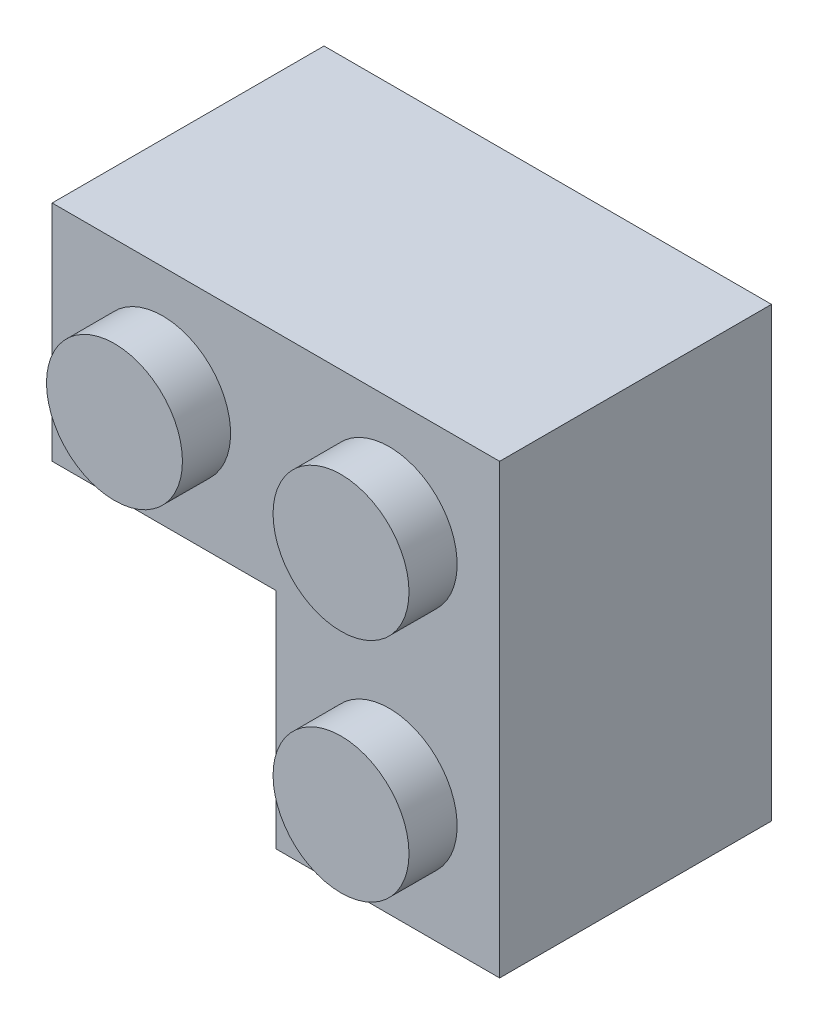
ISO-10303-21;
HEADER;
FILE_DESCRIPTION(('STEP AP214'),'2;1');
FILE_NAME('part.step','',(''),(''),'','','');
FILE_SCHEMA(('AUTOMOTIVE_DESIGN { 1 0 10303 214 1 1 1 1 }'));
ENDSEC;
DATA;
#1=APPLICATION_CONTEXT('core data for automotive mechanical design processes');
#2=APPLICATION_PROTOCOL_DEFINITION('international standard','automotive_design',2000,#1);
#3=PRODUCT_CONTEXT('',#1,'mechanical');
#4=PRODUCT('Part','Part','',(#3));
#5=PRODUCT_RELATED_PRODUCT_CATEGORY('part','',(#4));
#6=PRODUCT_DEFINITION_FORMATION('','',#4);
#7=PRODUCT_DEFINITION_CONTEXT('part definition',#1,'design');
#8=PRODUCT_DEFINITION('design','',#6,#7);
#9=PRODUCT_DEFINITION_SHAPE('','',#8);
#10=(LENGTH_UNIT() NAMED_UNIT(*) SI_UNIT(.MILLI.,.METRE.));
#11=(NAMED_UNIT(*) PLANE_ANGLE_UNIT() SI_UNIT($,.RADIAN.));
#12=(NAMED_UNIT(*) SI_UNIT($,.STERADIAN.) SOLID_ANGLE_UNIT());
#13=UNCERTAINTY_MEASURE_WITH_UNIT(LENGTH_MEASURE(1.E-05),#10,'distance_accuracy_value','');
#14=(GEOMETRIC_REPRESENTATION_CONTEXT(3) GLOBAL_UNCERTAINTY_ASSIGNED_CONTEXT((#13)) GLOBAL_UNIT_ASSIGNED_CONTEXT((#10,
#11,#12)) REPRESENTATION_CONTEXT('',''));
#15=CARTESIAN_POINT('',(0.,0.,0.));
#16=DIRECTION('',(0.,0.,1.));
#17=DIRECTION('',(1.,0.,0.));
#18=AXIS2_PLACEMENT_3D('',#15,#16,#17);
#19=CARTESIAN_POINT('',(7.9,7.90000000000001,9.6));
#20=DIRECTION('',(-1.,0.,0.));
#21=DIRECTION('',(0.,-1.,0.));
#22=AXIS2_PLACEMENT_3D('',#19,#20,#21);
#23=PLANE('',#22);
#24=DIRECTION('',(0.,1.,0.));
#25=VECTOR('',#24,1.);
#26=CARTESIAN_POINT('',(7.9,7.90000000000001,0.));
#27=LINE('',#26,#25);
#28=CARTESIAN_POINT('',(7.9,-7.9,0.));
#29=VERTEX_POINT('',#28);
#30=CARTESIAN_POINT('',(7.9,7.90000000000001,0.));
#31=VERTEX_POINT('',#30);
#32=EDGE_CURVE('E120',#29,#31,#27,.T.);
#33=ORIENTED_EDGE('',*,*,#32,.T.);
#34=DIRECTION('',(0.,0.,-1.));
#35=VECTOR('',#34,1.);
#36=CARTESIAN_POINT('',(7.9,7.90000000000001,9.6));
#37=LINE('',#36,#35);
#38=CARTESIAN_POINT('',(7.9,7.90000000000001,9.6));
#39=VERTEX_POINT('',#38);
#40=EDGE_CURVE('E138',#39,#31,#37,.T.);
#41=ORIENTED_EDGE('',*,*,#40,.F.);
#42=DIRECTION('',(0.,1.,0.));
#43=VECTOR('',#42,1.);
#44=CARTESIAN_POINT('',(7.9,7.90000000000001,9.6));
#45=LINE('',#44,#43);
#46=CARTESIAN_POINT('',(7.9,-7.9,9.6));
#47=VERTEX_POINT('',#46);
#48=EDGE_CURVE('E131',#47,#39,#45,.T.);
#49=ORIENTED_EDGE('',*,*,#48,.F.);
#50=DIRECTION('',(0.,0.,-1.));
#51=VECTOR('',#50,1.);
#52=CARTESIAN_POINT('',(7.9,-7.9,9.6));
#53=LINE('',#52,#51);
#54=EDGE_CURVE('E116',#47,#29,#53,.T.);
#55=ORIENTED_EDGE('',*,*,#54,.T.);
#56=EDGE_LOOP('',(#33,#41,#49,#55));
#57=FACE_BOUND('',#56,.T.);
#58=ADVANCED_FACE('F35',(#57),#23,.F.);
#59=CARTESIAN_POINT('',(7.9,7.90000000000001,9.6));
#60=DIRECTION('',(0.,-1.,0.));
#61=DIRECTION('',(1.,0.,0.));
#62=AXIS2_PLACEMENT_3D('',#59,#60,#61);
#63=PLANE('',#62);
#64=DIRECTION('',(-1.,0.,0.));
#65=VECTOR('',#64,1.);
#66=CARTESIAN_POINT('',(7.9,7.90000000000001,0.));
#67=LINE('',#66,#65);
#68=CARTESIAN_POINT('',(-7.9,7.9,0.));
#69=VERTEX_POINT('',#68);
#70=EDGE_CURVE('E123',#31,#69,#67,.T.);
#71=ORIENTED_EDGE('',*,*,#70,.T.);
#72=DIRECTION('',(0.,0.,-1.));
#73=VECTOR('',#72,1.);
#74=CARTESIAN_POINT('',(-7.9,7.9,9.6));
#75=LINE('',#74,#73);
#76=CARTESIAN_POINT('',(-7.9,7.9,9.6));
#77=VERTEX_POINT('',#76);
#78=EDGE_CURVE('E135',#77,#69,#75,.T.);
#79=ORIENTED_EDGE('',*,*,#78,.F.);
#80=DIRECTION('',(-1.,0.,0.));
#81=VECTOR('',#80,1.);
#82=CARTESIAN_POINT('',(7.9,7.90000000000001,9.6));
#83=LINE('',#82,#81);
#84=EDGE_CURVE('E89',#39,#77,#83,.T.);
#85=ORIENTED_EDGE('',*,*,#84,.F.);
#86=ORIENTED_EDGE('',*,*,#40,.T.);
#87=EDGE_LOOP('',(#71,#79,#85,#86));
#88=FACE_BOUND('',#87,.T.);
#89=ADVANCED_FACE('F170',(#88),#63,.F.);
#90=CARTESIAN_POINT('',(-7.9,7.9,9.6));
#91=DIRECTION('',(1.,0.,0.));
#92=DIRECTION('',(0.,1.,0.));
#93=AXIS2_PLACEMENT_3D('',#90,#91,#92);
#94=PLANE('',#93);
#95=DIRECTION('',(0.,-1.,0.));
#96=VECTOR('',#95,1.);
#97=CARTESIAN_POINT('',(-7.9,7.9,0.));
#98=LINE('',#97,#96);
#99=CARTESIAN_POINT('',(-7.9,0.,0.));
#100=VERTEX_POINT('',#99);
#101=EDGE_CURVE('E126',#69,#100,#98,.T.);
#102=ORIENTED_EDGE('',*,*,#101,.T.);
#103=DIRECTION('',(0.,0.,-1.));
#104=VECTOR('',#103,1.);
#105=CARTESIAN_POINT('',(-7.9,0.,9.6));
#106=LINE('',#105,#104);
#107=CARTESIAN_POINT('',(-7.9,0.,9.6));
#108=VERTEX_POINT('',#107);
#109=EDGE_CURVE('E111',#108,#100,#106,.T.);
#110=ORIENTED_EDGE('',*,*,#109,.F.);
#111=DIRECTION('',(0.,-1.,0.));
#112=VECTOR('',#111,1.);
#113=CARTESIAN_POINT('',(-7.9,7.9,9.6));
#114=LINE('',#113,#112);
#115=EDGE_CURVE('E102',#77,#108,#114,.T.);
#116=ORIENTED_EDGE('',*,*,#115,.F.);
#117=ORIENTED_EDGE('',*,*,#78,.T.);
#118=EDGE_LOOP('',(#102,#110,#116,#117));
#119=FACE_BOUND('',#118,.T.);
#120=ADVANCED_FACE('F175',(#119),#94,.F.);
#121=CARTESIAN_POINT('',(0.,0.,9.6));
#122=DIRECTION('',(0.,1.,0.));
#123=DIRECTION('',(0.,0.,1.));
#124=AXIS2_PLACEMENT_3D('',#121,#122,#123);
#125=PLANE('',#124);
#126=DIRECTION('',(1.,0.,0.));
#127=VECTOR('',#126,1.);
#128=CARTESIAN_POINT('',(0.,0.,0.));
#129=LINE('',#128,#127);
#130=CARTESIAN_POINT('',(0.,0.,0.));
#131=VERTEX_POINT('',#130);
#132=EDGE_CURVE('E110',#100,#131,#129,.T.);
#133=ORIENTED_EDGE('',*,*,#132,.T.);
#134=DIRECTION('',(0.,0.,-1.));
#135=VECTOR('',#134,1.);
#136=CARTESIAN_POINT('',(0.,0.,9.6));
#137=LINE('',#136,#135);
#138=CARTESIAN_POINT('',(0.,0.,9.6));
#139=VERTEX_POINT('',#138);
#140=EDGE_CURVE('E107',#139,#131,#137,.T.);
#141=ORIENTED_EDGE('',*,*,#140,.F.);
#142=DIRECTION('',(1.,0.,0.));
#143=VECTOR('',#142,1.);
#144=CARTESIAN_POINT('',(0.,0.,9.6));
#145=LINE('',#144,#143);
#146=EDGE_CURVE('E96',#108,#139,#145,.T.);
#147=ORIENTED_EDGE('',*,*,#146,.F.);
#148=ORIENTED_EDGE('',*,*,#109,.T.);
#149=EDGE_LOOP('',(#133,#141,#147,#148));
#150=FACE_BOUND('',#149,.T.);
#151=ADVANCED_FACE('F108',(#150),#125,.F.);
#152=CARTESIAN_POINT('',(0.,0.,9.6));
#153=DIRECTION('',(1.,0.,0.));
#154=DIRECTION('',(0.,0.,-1.));
#155=AXIS2_PLACEMENT_3D('',#152,#153,#154);
#156=PLANE('',#155);
#157=DIRECTION('',(0.,-1.,0.));
#158=VECTOR('',#157,1.);
#159=CARTESIAN_POINT('',(0.,0.,0.));
#160=LINE('',#159,#158);
#161=CARTESIAN_POINT('',(0.,-7.9,0.));
#162=VERTEX_POINT('',#161);
#163=EDGE_CURVE('E74',#131,#162,#160,.T.);
#164=ORIENTED_EDGE('',*,*,#163,.T.);
#165=DIRECTION('',(0.,0.,-1.));
#166=VECTOR('',#165,1.);
#167=CARTESIAN_POINT('',(0.,-7.9,9.6));
#168=LINE('',#167,#166);
#169=CARTESIAN_POINT('',(0.,-7.9,9.6));
#170=VERTEX_POINT('',#169);
#171=EDGE_CURVE('E112',#170,#162,#168,.T.);
#172=ORIENTED_EDGE('',*,*,#171,.F.);
#173=DIRECTION('',(0.,-1.,0.));
#174=VECTOR('',#173,1.);
#175=CARTESIAN_POINT('',(0.,0.,9.6));
#176=LINE('',#175,#174);
#177=EDGE_CURVE('E100',#139,#170,#176,.T.);
#178=ORIENTED_EDGE('',*,*,#177,.F.);
#179=ORIENTED_EDGE('',*,*,#140,.T.);
#180=EDGE_LOOP('',(#164,#172,#178,#179));
#181=FACE_BOUND('',#180,.T.);
#182=ADVANCED_FACE('F114',(#181),#156,.F.);
#183=CARTESIAN_POINT('',(7.9,-7.9,9.6));
#184=DIRECTION('',(0.,1.,0.));
#185=DIRECTION('',(-1.,0.,0.));
#186=AXIS2_PLACEMENT_3D('',#183,#184,#185);
#187=PLANE('',#186);
#188=DIRECTION('',(1.,0.,0.));
#189=VECTOR('',#188,1.);
#190=CARTESIAN_POINT('',(7.9,-7.9,0.));
#191=LINE('',#190,#189);
#192=EDGE_CURVE('E80',#162,#29,#191,.T.);
#193=ORIENTED_EDGE('',*,*,#192,.T.);
#194=ORIENTED_EDGE('',*,*,#54,.F.);
#195=DIRECTION('',(1.,0.,0.));
#196=VECTOR('',#195,1.);
#197=CARTESIAN_POINT('',(7.9,-7.9,9.6));
#198=LINE('',#197,#196);
#199=EDGE_CURVE('E51',#170,#47,#198,.T.);
#200=ORIENTED_EDGE('',*,*,#199,.F.);
#201=ORIENTED_EDGE('',*,*,#171,.T.);
#202=EDGE_LOOP('',(#193,#194,#200,#201));
#203=FACE_BOUND('',#202,.T.);
#204=ADVANCED_FACE('F150',(#203),#187,.F.);
#205=CARTESIAN_POINT('',(0.,0.,9.6));
#206=DIRECTION('',(0.,0.,-1.));
#207=DIRECTION('',(-1.,0.,0.));
#208=AXIS2_PLACEMENT_3D('',#205,#206,#207);
#209=PLANE('',#208);
#210=CARTESIAN_POINT('',(4.,-4.,9.6));
#211=DIRECTION('',(0.,0.,-1.));
#212=DIRECTION('',(-1.,0.,0.));
#213=AXIS2_PLACEMENT_3D('',#210,#211,#212);
#214=CIRCLE('',#213,2.4);
#215=CARTESIAN_POINT('',(1.60000000000001,-4.,9.6));
#216=VERTEX_POINT('',#215);
#217=EDGE_CURVE('E11',#216,#216,#214,.F.);
#218=ORIENTED_EDGE('',*,*,#217,.F.);
#219=EDGE_LOOP('',(#218));
#220=FACE_BOUND('',#219,.T.);
#221=CARTESIAN_POINT('',(4.,4.00000000000001,9.6));
#222=DIRECTION('',(0.,0.,-1.));
#223=DIRECTION('',(-1.,0.,0.));
#224=AXIS2_PLACEMENT_3D('',#221,#222,#223);
#225=CIRCLE('',#224,2.4);
#226=CARTESIAN_POINT('',(1.60000000000001,4.00000000000001,9.6));
#227=VERTEX_POINT('',#226);
#228=EDGE_CURVE('E43',#227,#227,#225,.F.);
#229=ORIENTED_EDGE('',*,*,#228,.F.);
#230=EDGE_LOOP('',(#229));
#231=FACE_BOUND('',#230,.T.);
#232=CARTESIAN_POINT('',(-4.,4.00000000000001,9.6));
#233=DIRECTION('',(0.,0.,-1.));
#234=DIRECTION('',(-1.,0.,0.));
#235=AXIS2_PLACEMENT_3D('',#232,#233,#234);
#236=CIRCLE('',#235,2.4);
#237=CARTESIAN_POINT('',(-6.4,4.00000000000001,9.6));
#238=VERTEX_POINT('',#237);
#239=EDGE_CURVE('E140',#238,#238,#236,.F.);
#240=ORIENTED_EDGE('',*,*,#239,.F.);
#241=EDGE_LOOP('',(#240));
#242=FACE_BOUND('',#241,.T.);
#243=ORIENTED_EDGE('',*,*,#48,.T.);
#244=ORIENTED_EDGE('',*,*,#84,.T.);
#245=ORIENTED_EDGE('',*,*,#115,.T.);
#246=ORIENTED_EDGE('',*,*,#146,.T.);
#247=ORIENTED_EDGE('',*,*,#177,.T.);
#248=ORIENTED_EDGE('',*,*,#199,.T.);
#249=EDGE_LOOP('',(#243,#244,#245,#246,#247,#248));
#250=FACE_BOUND('',#249,.T.);
#251=ADVANCED_FACE('F98',(#220,#231,#242,#250),#209,.F.);
#252=CARTESIAN_POINT('',(0.,0.,0.));
#253=DIRECTION('',(0.,0.,-1.));
#254=DIRECTION('',(-1.,0.,0.));
#255=AXIS2_PLACEMENT_3D('',#252,#253,#254);
#256=PLANE('',#255);
#257=CARTESIAN_POINT('',(-4.,4.00000000000001,0.));
#258=DIRECTION('',(0.,0.,-1.));
#259=DIRECTION('',(-1.,0.,0.));
#260=AXIS2_PLACEMENT_3D('',#257,#258,#259);
#261=CIRCLE('',#260,2.5);
#262=CARTESIAN_POINT('',(-6.5,4.00000000000001,0.));
#263=VERTEX_POINT('',#262);
#264=EDGE_CURVE('E206',#263,#263,#261,.T.);
#265=ORIENTED_EDGE('',*,*,#264,.F.);
#266=EDGE_LOOP('',(#265));
#267=FACE_BOUND('',#266,.T.);
#268=CARTESIAN_POINT('',(4.,4.00000000000001,0.));
#269=DIRECTION('',(0.,0.,-1.));
#270=DIRECTION('',(-1.,0.,0.));
#271=AXIS2_PLACEMENT_3D('',#268,#269,#270);
#272=CIRCLE('',#271,2.5);
#273=CARTESIAN_POINT('',(1.5,4.00000000000001,0.));
#274=VERTEX_POINT('',#273);
#275=EDGE_CURVE('E200',#274,#274,#272,.T.);
#276=ORIENTED_EDGE('',*,*,#275,.F.);
#277=EDGE_LOOP('',(#276));
#278=FACE_BOUND('',#277,.T.);
#279=CARTESIAN_POINT('',(4.,-4.,0.));
#280=DIRECTION('',(0.,0.,-1.));
#281=DIRECTION('',(-1.,0.,0.));
#282=AXIS2_PLACEMENT_3D('',#279,#280,#281);
#283=CIRCLE('',#282,2.5);
#284=CARTESIAN_POINT('',(1.5,-4.,0.));
#285=VERTEX_POINT('',#284);
#286=EDGE_CURVE('E194',#285,#285,#283,.T.);
#287=ORIENTED_EDGE('',*,*,#286,.F.);
#288=EDGE_LOOP('',(#287));
#289=FACE_BOUND('',#288,.T.);
#290=ORIENTED_EDGE('',*,*,#32,.F.);
#291=ORIENTED_EDGE('',*,*,#192,.F.);
#292=ORIENTED_EDGE('',*,*,#163,.F.);
#293=ORIENTED_EDGE('',*,*,#132,.F.);
#294=ORIENTED_EDGE('',*,*,#101,.F.);
#295=ORIENTED_EDGE('',*,*,#70,.F.);
#296=EDGE_LOOP('',(#290,#291,#292,#293,#294,#295));
#297=FACE_BOUND('',#296,.T.);
#298=ADVANCED_FACE('F149',(#267,#278,#289,#297),#256,.T.);
#299=CARTESIAN_POINT('',(-4.,4.00000000000001,11.3));
#300=DIRECTION('',(0.,0.,-1.));
#301=DIRECTION('',(-1.,0.,0.));
#302=AXIS2_PLACEMENT_3D('',#299,#300,#301);
#303=CYLINDRICAL_SURFACE('',#302,2.4);
#304=CARTESIAN_POINT('',(-4.,4.00000000000001,11.3));
#305=DIRECTION('',(0.,0.,1.));
#306=DIRECTION('',(1.,0.,0.));
#307=AXIS2_PLACEMENT_3D('',#304,#305,#306);
#308=CIRCLE('',#307,2.4);
#309=CARTESIAN_POINT('',(-1.6,4.00000000000001,11.3));
#310=VERTEX_POINT('',#309);
#311=EDGE_CURVE('E124',#310,#310,#308,.T.);
#312=ORIENTED_EDGE('',*,*,#311,.F.);
#313=EDGE_LOOP('',(#312));
#314=FACE_BOUND('',#313,.T.);
#315=ORIENTED_EDGE('',*,*,#239,.T.);
#316=EDGE_LOOP('',(#315));
#317=FACE_BOUND('',#316,.T.);
#318=ADVANCED_FACE('F155',(#314,#317),#303,.T.);
#319=CARTESIAN_POINT('',(-4.,4.00000000000001,11.3));
#320=DIRECTION('',(0.,0.,1.));
#321=DIRECTION('',(1.,0.,0.));
#322=AXIS2_PLACEMENT_3D('',#319,#320,#321);
#323=PLANE('',#322);
#324=ORIENTED_EDGE('',*,*,#311,.T.);
#325=EDGE_LOOP('',(#324));
#326=FACE_BOUND('',#325,.T.);
#327=ADVANCED_FACE('F157',(#326),#323,.T.);
#328=CARTESIAN_POINT('',(4.,4.00000000000001,11.3));
#329=DIRECTION('',(0.,0.,-1.));
#330=DIRECTION('',(-1.,0.,0.));
#331=AXIS2_PLACEMENT_3D('',#328,#329,#330);
#332=CYLINDRICAL_SURFACE('',#331,2.4);
#333=CARTESIAN_POINT('',(4.,4.00000000000001,11.3));
#334=DIRECTION('',(0.,0.,1.));
#335=DIRECTION('',(1.,0.,0.));
#336=AXIS2_PLACEMENT_3D('',#333,#334,#335);
#337=CIRCLE('',#336,2.4);
#338=CARTESIAN_POINT('',(6.4,4.00000000000001,11.3));
#339=VERTEX_POINT('',#338);
#340=EDGE_CURVE('E187',#339,#339,#337,.T.);
#341=ORIENTED_EDGE('',*,*,#340,.F.);
#342=EDGE_LOOP('',(#341));
#343=FACE_BOUND('',#342,.T.);
#344=ORIENTED_EDGE('',*,*,#228,.T.);
#345=EDGE_LOOP('',(#344));
#346=FACE_BOUND('',#345,.T.);
#347=ADVANCED_FACE('F145',(#343,#346),#332,.T.);
#348=CARTESIAN_POINT('',(4.,4.00000000000001,11.3));
#349=DIRECTION('',(0.,0.,1.));
#350=DIRECTION('',(1.,0.,0.));
#351=AXIS2_PLACEMENT_3D('',#348,#349,#350);
#352=PLANE('',#351);
#353=ORIENTED_EDGE('',*,*,#340,.T.);
#354=EDGE_LOOP('',(#353));
#355=FACE_BOUND('',#354,.T.);
#356=ADVANCED_FACE('F246',(#355),#352,.T.);
#357=CARTESIAN_POINT('',(4.,-4.,11.3));
#358=DIRECTION('',(0.,0.,-1.));
#359=DIRECTION('',(-1.,0.,0.));
#360=AXIS2_PLACEMENT_3D('',#357,#358,#359);
#361=CYLINDRICAL_SURFACE('',#360,2.4);
#362=CARTESIAN_POINT('',(4.,-4.,11.3));
#363=DIRECTION('',(0.,0.,1.));
#364=DIRECTION('',(1.,0.,0.));
#365=AXIS2_PLACEMENT_3D('',#362,#363,#364);
#366=CIRCLE('',#365,2.4);
#367=CARTESIAN_POINT('',(6.4,-4.,11.3));
#368=VERTEX_POINT('',#367);
#369=EDGE_CURVE('E190',#368,#368,#366,.T.);
#370=ORIENTED_EDGE('',*,*,#369,.F.);
#371=EDGE_LOOP('',(#370));
#372=FACE_BOUND('',#371,.T.);
#373=ORIENTED_EDGE('',*,*,#217,.T.);
#374=EDGE_LOOP('',(#373));
#375=FACE_BOUND('',#374,.T.);
#376=ADVANCED_FACE('F238',(#372,#375),#361,.T.);
#377=CARTESIAN_POINT('',(4.,-4.,11.3));
#378=DIRECTION('',(0.,0.,1.));
#379=DIRECTION('',(1.,0.,0.));
#380=AXIS2_PLACEMENT_3D('',#377,#378,#379);
#381=PLANE('',#380);
#382=ORIENTED_EDGE('',*,*,#369,.T.);
#383=EDGE_LOOP('',(#382));
#384=FACE_BOUND('',#383,.T.);
#385=ADVANCED_FACE('F228',(#384),#381,.T.);
#386=CARTESIAN_POINT('',(4.,-4.,1.8));
#387=DIRECTION('',(0.,0.,-1.));
#388=DIRECTION('',(-1.,0.,0.));
#389=AXIS2_PLACEMENT_3D('',#386,#387,#388);
#390=CYLINDRICAL_SURFACE('',#389,2.5);
#391=CARTESIAN_POINT('',(4.,-4.,1.8));
#392=DIRECTION('',(0.,0.,-1.));
#393=DIRECTION('',(-1.,0.,0.));
#394=AXIS2_PLACEMENT_3D('',#391,#392,#393);
#395=CIRCLE('',#394,2.5);
#396=CARTESIAN_POINT('',(1.5,-4.,1.8));
#397=VERTEX_POINT('',#396);
#398=EDGE_CURVE('E197',#397,#397,#395,.T.);
#399=ORIENTED_EDGE('',*,*,#398,.F.);
#400=EDGE_LOOP('',(#399));
#401=FACE_BOUND('',#400,.T.);
#402=ORIENTED_EDGE('',*,*,#286,.T.);
#403=EDGE_LOOP('',(#402));
#404=FACE_BOUND('',#403,.T.);
#405=ADVANCED_FACE('F225',(#401,#404),#390,.F.);
#406=CARTESIAN_POINT('',(4.,-4.,1.8));
#407=DIRECTION('',(0.,0.,-1.));
#408=DIRECTION('',(-1.,0.,0.));
#409=AXIS2_PLACEMENT_3D('',#406,#407,#408);
#410=PLANE('',#409);
#411=ORIENTED_EDGE('',*,*,#398,.T.);
#412=EDGE_LOOP('',(#411));
#413=FACE_BOUND('',#412,.T.);
#414=ADVANCED_FACE('F227',(#413),#410,.T.);
#415=CARTESIAN_POINT('',(4.,4.00000000000001,1.8));
#416=DIRECTION('',(0.,0.,-1.));
#417=DIRECTION('',(-1.,0.,0.));
#418=AXIS2_PLACEMENT_3D('',#415,#416,#417);
#419=CYLINDRICAL_SURFACE('',#418,2.5);
#420=CARTESIAN_POINT('',(4.,4.00000000000001,1.8));
#421=DIRECTION('',(0.,0.,-1.));
#422=DIRECTION('',(-1.,0.,0.));
#423=AXIS2_PLACEMENT_3D('',#420,#421,#422);
#424=CIRCLE('',#423,2.5);
#425=CARTESIAN_POINT('',(1.5,4.00000000000001,1.8));
#426=VERTEX_POINT('',#425);
#427=EDGE_CURVE('E203',#426,#426,#424,.T.);
#428=ORIENTED_EDGE('',*,*,#427,.F.);
#429=EDGE_LOOP('',(#428));
#430=FACE_BOUND('',#429,.T.);
#431=ORIENTED_EDGE('',*,*,#275,.T.);
#432=EDGE_LOOP('',(#431));
#433=FACE_BOUND('',#432,.T.);
#434=ADVANCED_FACE('F235',(#430,#433),#419,.F.);
#435=CARTESIAN_POINT('',(4.,4.00000000000001,1.8));
#436=DIRECTION('',(0.,0.,-1.));
#437=DIRECTION('',(-1.,0.,0.));
#438=AXIS2_PLACEMENT_3D('',#435,#436,#437);
#439=PLANE('',#438);
#440=ORIENTED_EDGE('',*,*,#427,.T.);
#441=EDGE_LOOP('',(#440));
#442=FACE_BOUND('',#441,.T.);
#443=ADVANCED_FACE('F217',(#442),#439,.T.);
#444=CARTESIAN_POINT('',(-4.,4.00000000000001,1.8));
#445=DIRECTION('',(0.,0.,-1.));
#446=DIRECTION('',(-1.,0.,0.));
#447=AXIS2_PLACEMENT_3D('',#444,#445,#446);
#448=CYLINDRICAL_SURFACE('',#447,2.5);
#449=CARTESIAN_POINT('',(-4.,4.00000000000001,1.8));
#450=DIRECTION('',(0.,0.,-1.));
#451=DIRECTION('',(-1.,0.,0.));
#452=AXIS2_PLACEMENT_3D('',#449,#450,#451);
#453=CIRCLE('',#452,2.5);
#454=CARTESIAN_POINT('',(-6.5,4.00000000000001,1.8));
#455=VERTEX_POINT('',#454);
#456=EDGE_CURVE('E193',#455,#455,#453,.T.);
#457=ORIENTED_EDGE('',*,*,#456,.F.);
#458=EDGE_LOOP('',(#457));
#459=FACE_BOUND('',#458,.T.);
#460=ORIENTED_EDGE('',*,*,#264,.T.);
#461=EDGE_LOOP('',(#460));
#462=FACE_BOUND('',#461,.T.);
#463=ADVANCED_FACE('F214',(#459,#462),#448,.F.);
#464=CARTESIAN_POINT('',(-4.,4.00000000000001,1.8));
#465=DIRECTION('',(0.,0.,-1.));
#466=DIRECTION('',(-1.,0.,0.));
#467=AXIS2_PLACEMENT_3D('',#464,#465,#466);
#468=PLANE('',#467);
#469=ORIENTED_EDGE('',*,*,#456,.T.);
#470=EDGE_LOOP('',(#469));
#471=FACE_BOUND('',#470,.T.);
#472=ADVANCED_FACE('F212',(#471),#468,.T.);
#473=CLOSED_SHELL('',(#58,#89,#120,#151,#182,#204,#251,#298,#318,#327,#347,#356,#376,#385,#405,
#414,#434,#443,#463,#472));
#474=MANIFOLD_SOLID_BREP('B2',#473);
#475=ADVANCED_BREP_SHAPE_REPRESENTATION('',(#18,#474),#14);
#476=SHAPE_DEFINITION_REPRESENTATION(#9,#475);
ENDSEC;
END-ISO-10303-21;
